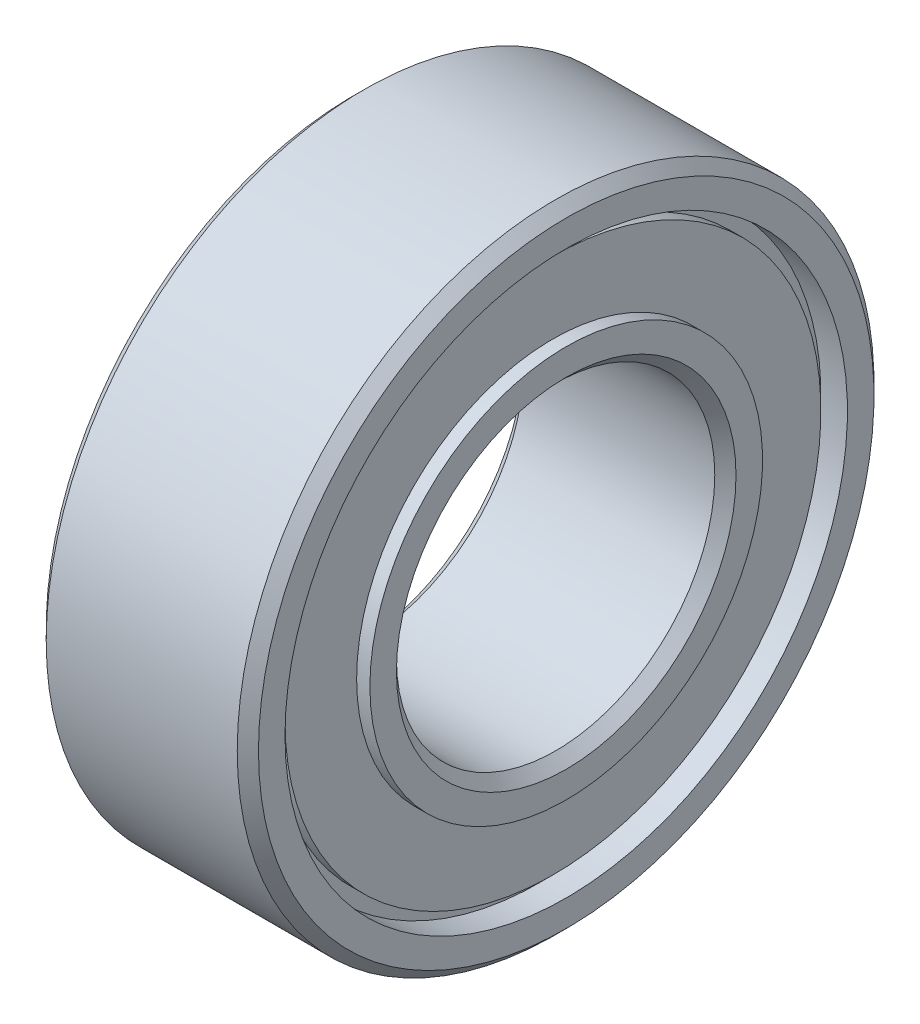
ISO-10303-21;
HEADER;
FILE_DESCRIPTION(('STEP AP214'),'2;1');
FILE_NAME('part.step','',(''),(''),'','','');
FILE_SCHEMA(('AUTOMOTIVE_DESIGN { 1 0 10303 214 1 1 1 1 }'));
ENDSEC;
DATA;
#1=APPLICATION_CONTEXT('core data for automotive mechanical design processes');
#2=APPLICATION_PROTOCOL_DEFINITION('international standard','automotive_design',2000,#1);
#3=PRODUCT_CONTEXT('',#1,'mechanical');
#4=PRODUCT('Part','Part','',(#3));
#5=PRODUCT_RELATED_PRODUCT_CATEGORY('part','',(#4));
#6=PRODUCT_DEFINITION_FORMATION('','',#4);
#7=PRODUCT_DEFINITION_CONTEXT('part definition',#1,'design');
#8=PRODUCT_DEFINITION('design','',#6,#7);
#9=PRODUCT_DEFINITION_SHAPE('','',#8);
#10=(LENGTH_UNIT() NAMED_UNIT(*) SI_UNIT(.MILLI.,.METRE.));
#11=(NAMED_UNIT(*) PLANE_ANGLE_UNIT() SI_UNIT($,.RADIAN.));
#12=(NAMED_UNIT(*) SI_UNIT($,.STERADIAN.) SOLID_ANGLE_UNIT());
#13=UNCERTAINTY_MEASURE_WITH_UNIT(LENGTH_MEASURE(1.E-05),#10,'distance_accuracy_value','');
#14=(GEOMETRIC_REPRESENTATION_CONTEXT(3) GLOBAL_UNCERTAINTY_ASSIGNED_CONTEXT((#13)) GLOBAL_UNIT_ASSIGNED_CONTEXT((#10,
#11,#12)) REPRESENTATION_CONTEXT('',''));
#15=CARTESIAN_POINT('',(0.,0.,0.));
#16=DIRECTION('',(0.,0.,1.));
#17=DIRECTION('',(1.,0.,0.));
#18=AXIS2_PLACEMENT_3D('',#15,#16,#17);
#19=CARTESIAN_POINT('',(-2.,5.3,0.));
#20=DIRECTION('',(1.,0.,0.));
#21=DIRECTION('',(0.,0.,-1.));
#22=AXIS2_PLACEMENT_3D('',#19,#20,#21);
#23=PLANE('',#22);
#24=CARTESIAN_POINT('',(-2.,0.,0.));
#25=DIRECTION('',(1.,0.,0.));
#26=DIRECTION('',(0.,0.,-1.));
#27=AXIS2_PLACEMENT_3D('',#24,#25,#26);
#28=CIRCLE('',#27,5.8);
#29=CARTESIAN_POINT('',(-2.,0.,-5.8));
#30=VERTEX_POINT('',#29);
#31=EDGE_CURVE('E10',#30,#30,#28,.F.);
#32=ORIENTED_EDGE('',*,*,#31,.T.);
#33=EDGE_LOOP('',(#32));
#34=FACE_BOUND('',#33,.T.);
#35=CARTESIAN_POINT('',(-2.,0.,0.));
#36=DIRECTION('',(-1.,0.,0.));
#37=DIRECTION('',(0.,0.,1.));
#38=AXIS2_PLACEMENT_3D('',#35,#36,#37);
#39=CIRCLE('',#38,5.3);
#40=CARTESIAN_POINT('',(-2.,0.,5.3));
#41=VERTEX_POINT('',#40);
#42=EDGE_CURVE('E70',#41,#41,#39,.T.);
#43=ORIENTED_EDGE('',*,*,#42,.F.);
#44=EDGE_LOOP('',(#43));
#45=FACE_BOUND('',#44,.T.);
#46=ADVANCED_FACE('F37',(#34,#45),#23,.F.);
#47=CARTESIAN_POINT('',(-3.90102380964335,0.,0.));
#48=DIRECTION('',(-1.,0.,0.));
#49=DIRECTION('',(0.,0.,1.));
#50=AXIS2_PLACEMENT_3D('',#47,#48,#49);
#51=CYLINDRICAL_SURFACE('',#50,5.3);
#52=CARTESIAN_POINT('',(-1.5,0.,0.));
#53=DIRECTION('',(-1.,0.,0.));
#54=DIRECTION('',(0.,0.,1.));
#55=AXIS2_PLACEMENT_3D('',#52,#53,#54);
#56=CIRCLE('',#55,5.3);
#57=CARTESIAN_POINT('',(-1.5,0.,5.3));
#58=VERTEX_POINT('',#57);
#59=EDGE_CURVE('E73',#58,#58,#56,.T.);
#60=ORIENTED_EDGE('',*,*,#59,.F.);
#61=EDGE_LOOP('',(#60));
#62=FACE_BOUND('',#61,.T.);
#63=ORIENTED_EDGE('',*,*,#42,.T.);
#64=EDGE_LOOP('',(#63));
#65=FACE_BOUND('',#64,.T.);
#66=ADVANCED_FACE('F151',(#62,#65),#51,.F.);
#67=CARTESIAN_POINT('',(-1.5,5.05,0.));
#68=DIRECTION('',(1.,0.,0.));
#69=DIRECTION('',(0.,0.,-1.));
#70=AXIS2_PLACEMENT_3D('',#67,#68,#69);
#71=PLANE('',#70);
#72=CARTESIAN_POINT('',(-1.5,0.,0.));
#73=DIRECTION('',(-1.,0.,0.));
#74=DIRECTION('',(0.,0.,1.));
#75=AXIS2_PLACEMENT_3D('',#72,#73,#74);
#76=CIRCLE('',#75,5.05);
#77=CARTESIAN_POINT('',(-1.5,0.,5.05));
#78=VERTEX_POINT('',#77);
#79=EDGE_CURVE('E76',#78,#78,#76,.T.);
#80=ORIENTED_EDGE('',*,*,#79,.F.);
#81=EDGE_LOOP('',(#80));
#82=FACE_BOUND('',#81,.T.);
#83=ORIENTED_EDGE('',*,*,#59,.T.);
#84=EDGE_LOOP('',(#83));
#85=FACE_BOUND('',#84,.T.);
#86=ADVANCED_FACE('F156',(#82,#85),#71,.F.);
#87=CARTESIAN_POINT('',(-3.90102380964335,0.,0.));
#88=DIRECTION('',(-1.,0.,0.));
#89=DIRECTION('',(0.,0.,1.));
#90=AXIS2_PLACEMENT_3D('',#87,#88,#89);
#91=CYLINDRICAL_SURFACE('',#90,5.05);
#92=CARTESIAN_POINT('',(-1.75,0.,0.));
#93=DIRECTION('',(-1.,0.,0.));
#94=DIRECTION('',(0.,0.,1.));
#95=AXIS2_PLACEMENT_3D('',#92,#93,#94);
#96=CIRCLE('',#95,5.05);
#97=CARTESIAN_POINT('',(-1.75,0.,5.05));
#98=VERTEX_POINT('',#97);
#99=EDGE_CURVE('E79',#98,#98,#96,.T.);
#100=ORIENTED_EDGE('',*,*,#99,.F.);
#101=EDGE_LOOP('',(#100));
#102=FACE_BOUND('',#101,.T.);
#103=ORIENTED_EDGE('',*,*,#79,.T.);
#104=EDGE_LOOP('',(#103));
#105=FACE_BOUND('',#104,.T.);
#106=ADVANCED_FACE('F243',(#102,#105),#91,.T.);
#107=CARTESIAN_POINT('',(-1.75,3.7,0.));
#108=DIRECTION('',(1.,0.,0.));
#109=DIRECTION('',(0.,0.,-1.));
#110=AXIS2_PLACEMENT_3D('',#107,#108,#109);
#111=PLANE('',#110);
#112=CARTESIAN_POINT('',(-1.75,0.,0.));
#113=DIRECTION('',(-1.,0.,0.));
#114=DIRECTION('',(0.,0.,1.));
#115=AXIS2_PLACEMENT_3D('',#112,#113,#114);
#116=CIRCLE('',#115,3.7);
#117=CARTESIAN_POINT('',(-1.75,0.,3.7));
#118=VERTEX_POINT('',#117);
#119=EDGE_CURVE('E82',#118,#118,#116,.T.);
#120=ORIENTED_EDGE('',*,*,#119,.F.);
#121=EDGE_LOOP('',(#120));
#122=FACE_BOUND('',#121,.T.);
#123=ORIENTED_EDGE('',*,*,#99,.T.);
#124=EDGE_LOOP('',(#123));
#125=FACE_BOUND('',#124,.T.);
#126=ADVANCED_FACE('F231',(#122,#125),#111,.F.);
#127=CARTESIAN_POINT('',(-3.90102380964335,0.,0.));
#128=DIRECTION('',(-1.,0.,0.));
#129=DIRECTION('',(0.,0.,1.));
#130=AXIS2_PLACEMENT_3D('',#127,#128,#129);
#131=CYLINDRICAL_SURFACE('',#130,3.7);
#132=CARTESIAN_POINT('',(-2.,0.,0.));
#133=DIRECTION('',(-1.,0.,0.));
#134=DIRECTION('',(0.,0.,1.));
#135=AXIS2_PLACEMENT_3D('',#132,#133,#134);
#136=CIRCLE('',#135,3.7);
#137=CARTESIAN_POINT('',(-2.,0.,3.7));
#138=VERTEX_POINT('',#137);
#139=EDGE_CURVE('E85',#138,#138,#136,.T.);
#140=ORIENTED_EDGE('',*,*,#139,.F.);
#141=EDGE_LOOP('',(#140));
#142=FACE_BOUND('',#141,.T.);
#143=ORIENTED_EDGE('',*,*,#119,.T.);
#144=EDGE_LOOP('',(#143));
#145=FACE_BOUND('',#144,.T.);
#146=ADVANCED_FACE('F226',(#142,#145),#131,.T.);
#147=CARTESIAN_POINT('',(-2.,3.,0.));
#148=DIRECTION('',(1.,0.,0.));
#149=DIRECTION('',(0.,0.,-1.));
#150=AXIS2_PLACEMENT_3D('',#147,#148,#149);
#151=PLANE('',#150);
#152=CARTESIAN_POINT('',(-2.,0.,0.));
#153=DIRECTION('',(1.,0.,0.));
#154=DIRECTION('',(0.,0.,-1.));
#155=AXIS2_PLACEMENT_3D('',#152,#153,#154);
#156=CIRCLE('',#155,3.2);
#157=CARTESIAN_POINT('',(-2.,0.,-3.2));
#158=VERTEX_POINT('',#157);
#159=EDGE_CURVE('E61',#158,#158,#156,.T.);
#160=ORIENTED_EDGE('',*,*,#159,.T.);
#161=EDGE_LOOP('',(#160));
#162=FACE_BOUND('',#161,.T.);
#163=ORIENTED_EDGE('',*,*,#139,.T.);
#164=EDGE_LOOP('',(#163));
#165=FACE_BOUND('',#164,.T.);
#166=ADVANCED_FACE('F147',(#162,#165),#151,.F.);
#167=CARTESIAN_POINT('',(-3.90102380964335,0.,0.));
#168=DIRECTION('',(-1.,0.,0.));
#169=DIRECTION('',(0.,0.,1.));
#170=AXIS2_PLACEMENT_3D('',#167,#168,#169);
#171=CYLINDRICAL_SURFACE('',#170,3.);
#172=CARTESIAN_POINT('',(-1.8,0.,0.));
#173=DIRECTION('',(1.,0.,0.));
#174=DIRECTION('',(0.,0.,-1.));
#175=AXIS2_PLACEMENT_3D('',#172,#173,#174);
#176=CIRCLE('',#175,3.);
#177=CARTESIAN_POINT('',(-1.8,0.,-3.));
#178=VERTEX_POINT('',#177);
#179=EDGE_CURVE('E64',#178,#178,#176,.F.);
#180=ORIENTED_EDGE('',*,*,#179,.T.);
#181=EDGE_LOOP('',(#180));
#182=FACE_BOUND('',#181,.T.);
#183=CARTESIAN_POINT('',(1.8,0.,0.));
#184=DIRECTION('',(-1.,0.,0.));
#185=DIRECTION('',(0.,0.,1.));
#186=AXIS2_PLACEMENT_3D('',#183,#184,#185);
#187=CIRCLE('',#186,3.);
#188=CARTESIAN_POINT('',(1.8,0.,3.));
#189=VERTEX_POINT('',#188);
#190=EDGE_CURVE('E67',#189,#189,#187,.F.);
#191=ORIENTED_EDGE('',*,*,#190,.T.);
#192=EDGE_LOOP('',(#191));
#193=FACE_BOUND('',#192,.T.);
#194=ADVANCED_FACE('F141',(#182,#193),#171,.F.);
#195=CARTESIAN_POINT('',(2.,3.,0.));
#196=DIRECTION('',(-1.,0.,0.));
#197=DIRECTION('',(0.,0.,1.));
#198=AXIS2_PLACEMENT_3D('',#195,#196,#197);
#199=PLANE('',#198);
#200=CARTESIAN_POINT('',(2.,0.,0.));
#201=DIRECTION('',(-1.,0.,0.));
#202=DIRECTION('',(0.,0.,1.));
#203=AXIS2_PLACEMENT_3D('',#200,#201,#202);
#204=CIRCLE('',#203,3.2);
#205=CARTESIAN_POINT('',(2.,0.,3.2));
#206=VERTEX_POINT('',#205);
#207=EDGE_CURVE('E58',#206,#206,#204,.T.);
#208=ORIENTED_EDGE('',*,*,#207,.T.);
#209=EDGE_LOOP('',(#208));
#210=FACE_BOUND('',#209,.T.);
#211=CARTESIAN_POINT('',(2.,0.,0.));
#212=DIRECTION('',(-1.,0.,0.));
#213=DIRECTION('',(0.,0.,1.));
#214=AXIS2_PLACEMENT_3D('',#211,#212,#213);
#215=CIRCLE('',#214,3.7);
#216=CARTESIAN_POINT('',(2.,0.,3.7));
#217=VERTEX_POINT('',#216);
#218=EDGE_CURVE('E88',#217,#217,#215,.T.);
#219=ORIENTED_EDGE('',*,*,#218,.F.);
#220=EDGE_LOOP('',(#219));
#221=FACE_BOUND('',#220,.T.);
#222=ADVANCED_FACE('F136',(#210,#221),#199,.F.);
#223=CARTESIAN_POINT('',(-3.90102380964335,0.,0.));
#224=DIRECTION('',(-1.,0.,0.));
#225=DIRECTION('',(0.,0.,1.));
#226=AXIS2_PLACEMENT_3D('',#223,#224,#225);
#227=CYLINDRICAL_SURFACE('',#226,3.7);
#228=CARTESIAN_POINT('',(1.75,0.,0.));
#229=DIRECTION('',(-1.,0.,0.));
#230=DIRECTION('',(0.,0.,1.));
#231=AXIS2_PLACEMENT_3D('',#228,#229,#230);
#232=CIRCLE('',#231,3.7);
#233=CARTESIAN_POINT('',(1.75,0.,3.7));
#234=VERTEX_POINT('',#233);
#235=EDGE_CURVE('E91',#234,#234,#232,.T.);
#236=ORIENTED_EDGE('',*,*,#235,.F.);
#237=EDGE_LOOP('',(#236));
#238=FACE_BOUND('',#237,.T.);
#239=ORIENTED_EDGE('',*,*,#218,.T.);
#240=EDGE_LOOP('',(#239));
#241=FACE_BOUND('',#240,.T.);
#242=ADVANCED_FACE('F130',(#238,#241),#227,.T.);
#243=CARTESIAN_POINT('',(1.75,3.7,0.));
#244=DIRECTION('',(-1.,0.,0.));
#245=DIRECTION('',(0.,0.,1.));
#246=AXIS2_PLACEMENT_3D('',#243,#244,#245);
#247=PLANE('',#246);
#248=CARTESIAN_POINT('',(1.75,0.,0.));
#249=DIRECTION('',(-1.,0.,0.));
#250=DIRECTION('',(0.,0.,1.));
#251=AXIS2_PLACEMENT_3D('',#248,#249,#250);
#252=CIRCLE('',#251,5.05);
#253=CARTESIAN_POINT('',(1.75,0.,5.05));
#254=VERTEX_POINT('',#253);
#255=EDGE_CURVE('E94',#254,#254,#252,.T.);
#256=ORIENTED_EDGE('',*,*,#255,.F.);
#257=EDGE_LOOP('',(#256));
#258=FACE_BOUND('',#257,.T.);
#259=ORIENTED_EDGE('',*,*,#235,.T.);
#260=EDGE_LOOP('',(#259));
#261=FACE_BOUND('',#260,.T.);
#262=ADVANCED_FACE('F124',(#258,#261),#247,.F.);
#263=CARTESIAN_POINT('',(-3.90102380964335,0.,0.));
#264=DIRECTION('',(-1.,0.,0.));
#265=DIRECTION('',(0.,0.,1.));
#266=AXIS2_PLACEMENT_3D('',#263,#264,#265);
#267=CYLINDRICAL_SURFACE('',#266,5.05);
#268=CARTESIAN_POINT('',(1.5,0.,0.));
#269=DIRECTION('',(-1.,0.,0.));
#270=DIRECTION('',(0.,0.,1.));
#271=AXIS2_PLACEMENT_3D('',#268,#269,#270);
#272=CIRCLE('',#271,5.05);
#273=CARTESIAN_POINT('',(1.5,0.,5.05));
#274=VERTEX_POINT('',#273);
#275=EDGE_CURVE('E97',#274,#274,#272,.T.);
#276=ORIENTED_EDGE('',*,*,#275,.F.);
#277=EDGE_LOOP('',(#276));
#278=FACE_BOUND('',#277,.T.);
#279=ORIENTED_EDGE('',*,*,#255,.T.);
#280=EDGE_LOOP('',(#279));
#281=FACE_BOUND('',#280,.T.);
#282=ADVANCED_FACE('F118',(#278,#281),#267,.T.);
#283=CARTESIAN_POINT('',(1.5,5.05,0.));
#284=DIRECTION('',(-1.,0.,0.));
#285=DIRECTION('',(0.,0.,1.));
#286=AXIS2_PLACEMENT_3D('',#283,#284,#285);
#287=PLANE('',#286);
#288=CARTESIAN_POINT('',(1.5,0.,0.));
#289=DIRECTION('',(-1.,0.,0.));
#290=DIRECTION('',(0.,0.,1.));
#291=AXIS2_PLACEMENT_3D('',#288,#289,#290);
#292=CIRCLE('',#291,5.3);
#293=CARTESIAN_POINT('',(1.5,0.,5.3));
#294=VERTEX_POINT('',#293);
#295=EDGE_CURVE('E100',#294,#294,#292,.T.);
#296=ORIENTED_EDGE('',*,*,#295,.F.);
#297=EDGE_LOOP('',(#296));
#298=FACE_BOUND('',#297,.T.);
#299=ORIENTED_EDGE('',*,*,#275,.T.);
#300=EDGE_LOOP('',(#299));
#301=FACE_BOUND('',#300,.T.);
#302=ADVANCED_FACE('F112',(#298,#301),#287,.F.);
#303=CARTESIAN_POINT('',(-3.90102380964335,0.,0.));
#304=DIRECTION('',(-1.,0.,0.));
#305=DIRECTION('',(0.,0.,1.));
#306=AXIS2_PLACEMENT_3D('',#303,#304,#305);
#307=CYLINDRICAL_SURFACE('',#306,5.3);
#308=CARTESIAN_POINT('',(2.,0.,0.));
#309=DIRECTION('',(-1.,0.,0.));
#310=DIRECTION('',(0.,0.,1.));
#311=AXIS2_PLACEMENT_3D('',#308,#309,#310);
#312=CIRCLE('',#311,5.3);
#313=CARTESIAN_POINT('',(2.,0.,5.3));
#314=VERTEX_POINT('',#313);
#315=EDGE_CURVE('E103',#314,#314,#312,.T.);
#316=ORIENTED_EDGE('',*,*,#315,.F.);
#317=EDGE_LOOP('',(#316));
#318=FACE_BOUND('',#317,.T.);
#319=ORIENTED_EDGE('',*,*,#295,.T.);
#320=EDGE_LOOP('',(#319));
#321=FACE_BOUND('',#320,.T.);
#322=ADVANCED_FACE('F109',(#318,#321),#307,.F.);
#323=CARTESIAN_POINT('',(2.,5.3,0.));
#324=DIRECTION('',(-1.,0.,0.));
#325=DIRECTION('',(0.,0.,1.));
#326=AXIS2_PLACEMENT_3D('',#323,#324,#325);
#327=PLANE('',#326);
#328=CARTESIAN_POINT('',(2.,0.,0.));
#329=DIRECTION('',(-1.,0.,0.));
#330=DIRECTION('',(0.,0.,1.));
#331=AXIS2_PLACEMENT_3D('',#328,#329,#330);
#332=CIRCLE('',#331,5.8);
#333=CARTESIAN_POINT('',(2.,0.,5.8));
#334=VERTEX_POINT('',#333);
#335=EDGE_CURVE('E45',#334,#334,#332,.F.);
#336=ORIENTED_EDGE('',*,*,#335,.T.);
#337=EDGE_LOOP('',(#336));
#338=FACE_BOUND('',#337,.T.);
#339=ORIENTED_EDGE('',*,*,#315,.T.);
#340=EDGE_LOOP('',(#339));
#341=FACE_BOUND('',#340,.T.);
#342=ADVANCED_FACE('F107',(#338,#341),#327,.F.);
#343=CARTESIAN_POINT('',(-3.90102380964335,0.,0.));
#344=DIRECTION('',(-1.,0.,0.));
#345=DIRECTION('',(0.,0.,1.));
#346=AXIS2_PLACEMENT_3D('',#343,#344,#345);
#347=CYLINDRICAL_SURFACE('',#346,6.);
#348=CARTESIAN_POINT('',(1.8,0.,0.));
#349=DIRECTION('',(-1.,0.,0.));
#350=DIRECTION('',(0.,0.,1.));
#351=AXIS2_PLACEMENT_3D('',#348,#349,#350);
#352=CIRCLE('',#351,6.);
#353=CARTESIAN_POINT('',(1.8,0.,6.));
#354=VERTEX_POINT('',#353);
#355=EDGE_CURVE('E49',#354,#354,#352,.T.);
#356=ORIENTED_EDGE('',*,*,#355,.T.);
#357=EDGE_LOOP('',(#356));
#358=FACE_BOUND('',#357,.T.);
#359=CARTESIAN_POINT('',(-1.79999999999999,0.,0.));
#360=DIRECTION('',(1.,0.,0.));
#361=DIRECTION('',(0.,0.,-1.));
#362=AXIS2_PLACEMENT_3D('',#359,#360,#361);
#363=CIRCLE('',#362,6.);
#364=CARTESIAN_POINT('',(-1.79999999999999,0.,-6.));
#365=VERTEX_POINT('',#364);
#366=EDGE_CURVE('E53',#365,#365,#363,.T.);
#367=ORIENTED_EDGE('',*,*,#366,.T.);
#368=EDGE_LOOP('',(#367));
#369=FACE_BOUND('',#368,.T.);
#370=ADVANCED_FACE('F170',(#358,#369),#347,.T.);
#371=CARTESIAN_POINT('',(-1.8,0.,0.));
#372=DIRECTION('',(-1.,0.,0.));
#373=DIRECTION('',(0.,0.,1.));
#374=AXIS2_PLACEMENT_3D('',#371,#372,#373);
#375=CONICAL_SURFACE('',#374,3.,0.785398163397447);
#376=ORIENTED_EDGE('',*,*,#159,.F.);
#377=EDGE_LOOP('',(#376));
#378=FACE_BOUND('',#377,.T.);
#379=ORIENTED_EDGE('',*,*,#179,.F.);
#380=EDGE_LOOP('',(#379));
#381=FACE_BOUND('',#380,.T.);
#382=ADVANCED_FACE('F163',(#378,#381),#375,.F.);
#383=CARTESIAN_POINT('',(2.,0.,0.));
#384=DIRECTION('',(1.,0.,0.));
#385=DIRECTION('',(0.,0.,-1.));
#386=AXIS2_PLACEMENT_3D('',#383,#384,#385);
#387=CONICAL_SURFACE('',#386,3.2,0.785398163397446);
#388=ORIENTED_EDGE('',*,*,#190,.F.);
#389=EDGE_LOOP('',(#388));
#390=FACE_BOUND('',#389,.T.);
#391=ORIENTED_EDGE('',*,*,#207,.F.);
#392=EDGE_LOOP('',(#391));
#393=FACE_BOUND('',#392,.T.);
#394=ADVANCED_FACE('F169',(#390,#393),#387,.F.);
#395=CARTESIAN_POINT('',(1.8,0.,0.));
#396=DIRECTION('',(-1.,0.,0.));
#397=DIRECTION('',(0.,0.,1.));
#398=AXIS2_PLACEMENT_3D('',#395,#396,#397);
#399=CONICAL_SURFACE('',#398,6.,0.785398163397448);
#400=ORIENTED_EDGE('',*,*,#335,.F.);
#401=EDGE_LOOP('',(#400));
#402=FACE_BOUND('',#401,.T.);
#403=ORIENTED_EDGE('',*,*,#355,.F.);
#404=EDGE_LOOP('',(#403));
#405=FACE_BOUND('',#404,.T.);
#406=ADVANCED_FACE('F176',(#402,#405),#399,.T.);
#407=CARTESIAN_POINT('',(-2.,0.,0.));
#408=DIRECTION('',(1.,0.,0.));
#409=DIRECTION('',(0.,0.,-1.));
#410=AXIS2_PLACEMENT_3D('',#407,#408,#409);
#411=CONICAL_SURFACE('',#410,5.8,0.785398163397442);
#412=CARTESIAN_POINT('',(-1.79999999999999,0.,-6.));
#413=CARTESIAN_POINT('',(-1.80208333333333,0.,-5.99791666666667));
#414=CARTESIAN_POINT('',(-1.80416666666666,0.,-5.99583333333333));
#415=CARTESIAN_POINT('',(-1.80833333333333,0.,-5.99166666666667));
#416=CARTESIAN_POINT('',(-1.81041666666666,0.,-5.98958333333333));
#417=CARTESIAN_POINT('',(-1.81458333333333,0.,-5.98541666666667));
#418=CARTESIAN_POINT('',(-1.81666666666666,0.,-5.98333333333333));
#419=CARTESIAN_POINT('',(-1.82083333333333,0.,-5.97916666666667));
#420=CARTESIAN_POINT('',(-1.82291666666666,0.,-5.97708333333333));
#421=CARTESIAN_POINT('',(-1.82708333333333,0.,-5.97291666666667));
#422=CARTESIAN_POINT('',(-1.82916666666666,0.,-5.97083333333333));
#423=CARTESIAN_POINT('',(-1.83333333333333,0.,-5.96666666666667));
#424=CARTESIAN_POINT('',(-1.83541666666666,0.,-5.96458333333333));
#425=CARTESIAN_POINT('',(-1.83958333333333,0.,-5.96041666666667));
#426=CARTESIAN_POINT('',(-1.84166666666666,0.,-5.95833333333333));
#427=CARTESIAN_POINT('',(-1.84583333333333,0.,-5.95416666666667));
#428=CARTESIAN_POINT('',(-1.84791666666666,0.,-5.95208333333333));
#429=CARTESIAN_POINT('',(-1.85208333333333,0.,-5.94791666666667));
#430=CARTESIAN_POINT('',(-1.85416666666666,0.,-5.94583333333333));
#431=CARTESIAN_POINT('',(-1.85833333333333,0.,-5.94166666666667));
#432=CARTESIAN_POINT('',(-1.86041666666666,0.,-5.93958333333333));
#433=CARTESIAN_POINT('',(-1.86458333333333,0.,-5.93541666666667));
#434=CARTESIAN_POINT('',(-1.86666666666666,0.,-5.93333333333333));
#435=CARTESIAN_POINT('',(-1.87083333333333,0.,-5.92916666666667));
#436=CARTESIAN_POINT('',(-1.87291666666666,0.,-5.92708333333333));
#437=CARTESIAN_POINT('',(-1.87708333333333,0.,-5.92291666666667));
#438=CARTESIAN_POINT('',(-1.87916666666666,0.,-5.92083333333333));
#439=CARTESIAN_POINT('',(-1.88333333333333,0.,-5.91666666666667));
#440=CARTESIAN_POINT('',(-1.88541666666666,0.,-5.91458333333333));
#441=CARTESIAN_POINT('',(-1.88958333333333,0.,-5.91041666666667));
#442=CARTESIAN_POINT('',(-1.89166666666666,0.,-5.90833333333333));
#443=CARTESIAN_POINT('',(-1.89583333333333,0.,-5.90416666666667));
#444=CARTESIAN_POINT('',(-1.89791666666666,0.,-5.90208333333333));
#445=CARTESIAN_POINT('',(-1.90208333333333,0.,-5.89791666666667));
#446=CARTESIAN_POINT('',(-1.90416666666666,0.,-5.89583333333333));
#447=CARTESIAN_POINT('',(-1.90833333333333,0.,-5.89166666666667));
#448=CARTESIAN_POINT('',(-1.91041666666666,0.,-5.88958333333333));
#449=CARTESIAN_POINT('',(-1.91458333333333,0.,-5.88541666666667));
#450=CARTESIAN_POINT('',(-1.91666666666666,0.,-5.88333333333333));
#451=CARTESIAN_POINT('',(-1.92083333333333,0.,-5.87916666666667));
#452=CARTESIAN_POINT('',(-1.92291666666666,0.,-5.87708333333333));
#453=CARTESIAN_POINT('',(-1.92708333333333,0.,-5.87291666666667));
#454=CARTESIAN_POINT('',(-1.92916666666666,0.,-5.87083333333333));
#455=CARTESIAN_POINT('',(-1.93333333333333,0.,-5.86666666666667));
#456=CARTESIAN_POINT('',(-1.93541666666666,0.,-5.86458333333333));
#457=CARTESIAN_POINT('',(-1.93958333333333,0.,-5.86041666666667));
#458=CARTESIAN_POINT('',(-1.94166666666666,0.,-5.85833333333333));
#459=CARTESIAN_POINT('',(-1.94583333333333,0.,-5.85416666666667));
#460=CARTESIAN_POINT('',(-1.94791666666666,0.,-5.85208333333333));
#461=CARTESIAN_POINT('',(-1.95208333333333,0.,-5.84791666666667));
#462=CARTESIAN_POINT('',(-1.95416666666666,0.,-5.84583333333333));
#463=CARTESIAN_POINT('',(-1.95833333333333,0.,-5.84166666666667));
#464=CARTESIAN_POINT('',(-1.96041666666666,0.,-5.83958333333333));
#465=CARTESIAN_POINT('',(-1.96458333333333,0.,-5.83541666666667));
#466=CARTESIAN_POINT('',(-1.96666666666667,0.,-5.83333333333333));
#467=CARTESIAN_POINT('',(-1.97083333333333,0.,-5.82916666666666));
#468=CARTESIAN_POINT('',(-1.97291666666667,0.,-5.82708333333333));
#469=CARTESIAN_POINT('',(-1.97708333333333,0.,-5.82291666666666));
#470=CARTESIAN_POINT('',(-1.97916666666667,0.,-5.82083333333333));
#471=CARTESIAN_POINT('',(-1.98333333333333,0.,-5.81666666666666));
#472=CARTESIAN_POINT('',(-1.98541666666667,0.,-5.81458333333333));
#473=CARTESIAN_POINT('',(-1.98958333333333,0.,-5.81041666666667));
#474=CARTESIAN_POINT('',(-1.99166666666667,0.,-5.80833333333333));
#475=CARTESIAN_POINT('',(-1.99583333333333,0.,-5.80416666666667));
#476=CARTESIAN_POINT('',(-1.99791666666667,0.,-5.80208333333333));
#477=CARTESIAN_POINT('',(-2.,0.,-5.8));
#478=B_SPLINE_CURVE_WITH_KNOTS('',3,(#412,#413,#414,#415,#416,#417,#418,#419,#420,#421,#422,
#423,#424,#425,#426,#427,#428,#429,#430,#431,#432,#433,#434,#435,#436,#437,#438,#439,#440,#441,
#442,#443,#444,#445,#446,#447,#448,#449,#450,#451,#452,#453,#454,#455,#456,#457,#458,#459,#460,
#461,#462,#463,#464,#465,#466,#467,#468,#469,#470,#471,#472,#473,#474,#475,#476,#477),
.UNSPECIFIED.,.F.,.F.,(4,2,2,2,2,2,2,2,2,2,2,2,2,2,2,2,2,2,2,2,2,2,2,2,2,2,2,2,2,2,2,2,4),(0.,
0.00883883476483194,0.017677669529664,0.0265165042944961,0.0353553390593282,0.0441941738241603,
0.0530330085889918,0.0618718433538239,0.070710678118656,0.0795495128834881,0.0883883476483202,
0.0972271824131521,0.106066017177984,0.114904851942816,0.123743686707648,0.13258252147248,
0.141421356237312,0.150260191002144,0.159099025766976,0.167937860531808,0.17677669529664,
0.185615530061472,0.194454364826304,0.203293199591136,0.212132034355968,0.2209708691208,
0.229809703885632,0.238648538650464,0.247487373415296,0.256326208180128,0.26516504294496,
0.274003877709792,0.282842712474624),.UNSPECIFIED.);
#479=EDGE_CURVE('BSEAM40',#365,#30,#478,.T.);
#480=ORIENTED_EDGE('',*,*,#366,.F.);
#481=ORIENTED_EDGE('',*,*,#31,.F.);
#482=ORIENTED_EDGE('',*,*,#479,.T.);
#483=ORIENTED_EDGE('',*,*,#479,.F.);
#484=EDGE_LOOP('',(#480,#482,#481,#483));
#485=FACE_BOUND('',#484,.T.);
#486=ADVANCED_FACE('F40',(#485),#411,.T.);
#487=CLOSED_SHELL('',(#46,#66,#86,#106,#126,#146,#166,#194,#222,#242,#262,#282,#302,#322,#342,
#370,#382,#394,#406,#486));
#488=MANIFOLD_SOLID_BREP('B2',#487);
#489=ADVANCED_BREP_SHAPE_REPRESENTATION('',(#18,#488),#14);
#490=SHAPE_DEFINITION_REPRESENTATION(#9,#489);
ENDSEC;
END-ISO-10303-21;
